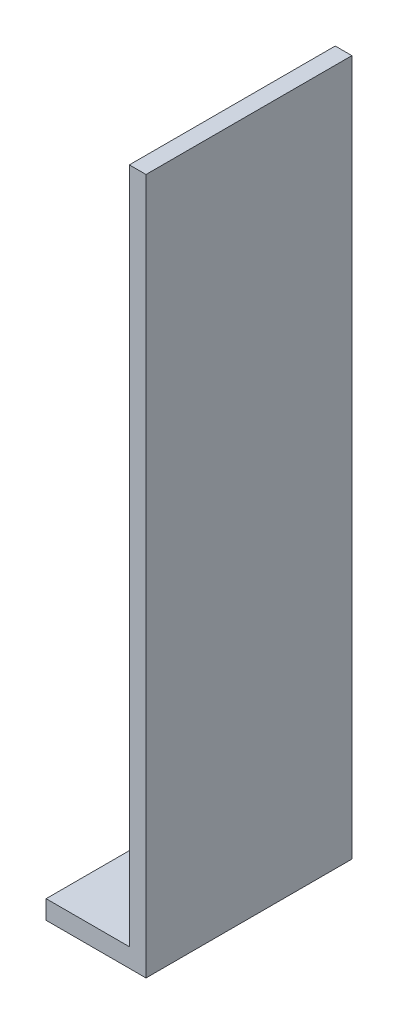
ISO-10303-21;
HEADER;
FILE_DESCRIPTION(('STEP AP214'),'2;1');
FILE_NAME('part.step','',(''),(''),'','','');
FILE_SCHEMA(('AUTOMOTIVE_DESIGN { 1 0 10303 214 1 1 1 1 }'));
ENDSEC;
DATA;
#1=APPLICATION_CONTEXT('core data for automotive mechanical design processes');
#2=APPLICATION_PROTOCOL_DEFINITION('international standard','automotive_design',2000,#1);
#3=PRODUCT_CONTEXT('',#1,'mechanical');
#4=PRODUCT('Part','Part','',(#3));
#5=PRODUCT_RELATED_PRODUCT_CATEGORY('part','',(#4));
#6=PRODUCT_DEFINITION_FORMATION('','',#4);
#7=PRODUCT_DEFINITION_CONTEXT('part definition',#1,'design');
#8=PRODUCT_DEFINITION('design','',#6,#7);
#9=PRODUCT_DEFINITION_SHAPE('','',#8);
#10=(LENGTH_UNIT() NAMED_UNIT(*) SI_UNIT(.MILLI.,.METRE.));
#11=(NAMED_UNIT(*) PLANE_ANGLE_UNIT() SI_UNIT($,.RADIAN.));
#12=(NAMED_UNIT(*) SI_UNIT($,.STERADIAN.) SOLID_ANGLE_UNIT());
#13=UNCERTAINTY_MEASURE_WITH_UNIT(LENGTH_MEASURE(1.E-05),#10,'distance_accuracy_value','');
#14=(GEOMETRIC_REPRESENTATION_CONTEXT(3) GLOBAL_UNCERTAINTY_ASSIGNED_CONTEXT((#13)) GLOBAL_UNIT_ASSIGNED_CONTEXT((#10,
#11,#12)) REPRESENTATION_CONTEXT('',''));
#15=CARTESIAN_POINT('',(0.,0.,0.));
#16=DIRECTION('',(0.,0.,1.));
#17=DIRECTION('',(1.,0.,0.));
#18=AXIS2_PLACEMENT_3D('',#15,#16,#17);
#19=CARTESIAN_POINT('',(0.,-60.6200216651723,68.));
#20=DIRECTION('',(1.,0.,0.));
#21=DIRECTION('',(0.,1.,0.));
#22=AXIS2_PLACEMENT_3D('',#19,#20,#21);
#23=PLANE('',#22);
#24=DIRECTION('',(0.,0.,-1.));
#25=VECTOR('',#24,1.);
#26=CARTESIAN_POINT('',(0.,-60.6200216651723,68.));
#27=LINE('',#26,#25);
#28=CARTESIAN_POINT('',(0.,-60.6200216651723,68.));
#29=VERTEX_POINT('',#28);
#30=CARTESIAN_POINT('',(0.,-60.6200216651723,18.0000000000003));
#31=VERTEX_POINT('',#30);
#32=EDGE_CURVE('E116',#29,#31,#27,.T.);
#33=ORIENTED_EDGE('',*,*,#32,.T.);
#34=DIRECTION('',(0.,1.,0.));
#35=VECTOR('',#34,1.);
#36=CARTESIAN_POINT('',(0.,-65.1756032212671,18.0000000000003));
#37=LINE('',#36,#35);
#38=CARTESIAN_POINT('',(0.,-65.1756032212671,18.0000000000003));
#39=VERTEX_POINT('',#38);
#40=EDGE_CURVE('E50',#39,#31,#37,.T.);
#41=ORIENTED_EDGE('',*,*,#40,.F.);
#42=DIRECTION('',(0.,0.,-1.));
#43=VECTOR('',#42,1.);
#44=CARTESIAN_POINT('',(0.,-65.1756032212671,68.));
#45=LINE('',#44,#43);
#46=CARTESIAN_POINT('',(0.,-65.1756032212671,68.));
#47=VERTEX_POINT('',#46);
#48=EDGE_CURVE('E11',#47,#39,#45,.T.);
#49=ORIENTED_EDGE('',*,*,#48,.F.);
#50=DIRECTION('',(0.,-1.,0.));
#51=VECTOR('',#50,1.);
#52=CARTESIAN_POINT('',(0.,-60.6200216651723,68.));
#53=LINE('',#52,#51);
#54=EDGE_CURVE('E103',#29,#47,#53,.T.);
#55=ORIENTED_EDGE('',*,*,#54,.F.);
#56=EDGE_LOOP('',(#33,#41,#49,#55));
#57=FACE_BOUND('',#56,.T.);
#58=ADVANCED_FACE('F36',(#57),#23,.F.);
#59=CARTESIAN_POINT('',(0.,-65.1756032212671,68.));
#60=DIRECTION('',(0.,1.,0.));
#61=DIRECTION('',(0.,0.,1.));
#62=AXIS2_PLACEMENT_3D('',#59,#60,#61);
#63=PLANE('',#62);
#64=ORIENTED_EDGE('',*,*,#48,.T.);
#65=DIRECTION('',(-1.,0.,0.));
#66=VECTOR('',#65,1.);
#67=CARTESIAN_POINT('',(24.2604104683441,-65.1756032212671,18.0000000000003));
#68=LINE('',#67,#66);
#69=CARTESIAN_POINT('',(24.2604104683441,-65.1756032212671,18.0000000000003));
#70=VERTEX_POINT('',#69);
#71=EDGE_CURVE('E90',#70,#39,#68,.T.);
#72=ORIENTED_EDGE('',*,*,#71,.F.);
#73=DIRECTION('',(0.,0.,-1.));
#74=VECTOR('',#73,1.);
#75=CARTESIAN_POINT('',(24.2604104683441,-65.1756032212671,68.));
#76=LINE('',#75,#74);
#77=CARTESIAN_POINT('',(24.2604104683441,-65.1756032212671,68.));
#78=VERTEX_POINT('',#77);
#79=EDGE_CURVE('E43',#78,#70,#76,.T.);
#80=ORIENTED_EDGE('',*,*,#79,.F.);
#81=DIRECTION('',(1.,0.,0.));
#82=VECTOR('',#81,1.);
#83=CARTESIAN_POINT('',(0.,-65.1756032212671,68.));
#84=LINE('',#83,#82);
#85=EDGE_CURVE('E125',#47,#78,#84,.T.);
#86=ORIENTED_EDGE('',*,*,#85,.F.);
#87=EDGE_LOOP('',(#64,#72,#80,#86));
#88=FACE_BOUND('',#87,.T.);
#89=ADVANCED_FACE('F100',(#88),#63,.F.);
#90=CARTESIAN_POINT('',(24.2604104683441,-65.1756032212671,68.));
#91=DIRECTION('',(-1.,0.,0.));
#92=DIRECTION('',(0.,0.,1.));
#93=AXIS2_PLACEMENT_3D('',#90,#91,#92);
#94=PLANE('',#93);
#95=ORIENTED_EDGE('',*,*,#79,.T.);
#96=DIRECTION('',(0.,-1.,0.));
#97=VECTOR('',#96,1.);
#98=CARTESIAN_POINT('',(24.2604104683441,103.824396778733,18.0000000000003));
#99=LINE('',#98,#97);
#100=CARTESIAN_POINT('',(24.2604104683441,103.824396778733,18.0000000000003));
#101=VERTEX_POINT('',#100);
#102=EDGE_CURVE('E87',#101,#70,#99,.T.);
#103=ORIENTED_EDGE('',*,*,#102,.F.);
#104=DIRECTION('',(0.,0.,-1.));
#105=VECTOR('',#104,1.);
#106=CARTESIAN_POINT('',(24.2604104683441,103.824396778733,68.));
#107=LINE('',#106,#105);
#108=CARTESIAN_POINT('',(24.2604104683441,103.824396778733,68.));
#109=VERTEX_POINT('',#108);
#110=EDGE_CURVE('E107',#109,#101,#107,.T.);
#111=ORIENTED_EDGE('',*,*,#110,.F.);
#112=DIRECTION('',(0.,1.,0.));
#113=VECTOR('',#112,1.);
#114=CARTESIAN_POINT('',(24.2604104683441,-65.1756032212671,68.));
#115=LINE('',#114,#113);
#116=EDGE_CURVE('E106',#78,#109,#115,.T.);
#117=ORIENTED_EDGE('',*,*,#116,.F.);
#118=EDGE_LOOP('',(#95,#103,#111,#117));
#119=FACE_BOUND('',#118,.T.);
#120=ADVANCED_FACE('F105',(#119),#94,.F.);
#121=CARTESIAN_POINT('',(24.2604104683441,103.824396778733,68.));
#122=DIRECTION('',(0.,-1.,0.));
#123=DIRECTION('',(0.,0.,-1.));
#124=AXIS2_PLACEMENT_3D('',#121,#122,#123);
#125=PLANE('',#124);
#126=ORIENTED_EDGE('',*,*,#110,.T.);
#127=DIRECTION('',(1.,0.,0.));
#128=VECTOR('',#127,1.);
#129=CARTESIAN_POINT('',(20.2141706881323,103.824396778733,18.0000000000003));
#130=LINE('',#129,#128);
#131=CARTESIAN_POINT('',(20.2141706881323,103.824396778733,18.0000000000003));
#132=VERTEX_POINT('',#131);
#133=EDGE_CURVE('E92',#132,#101,#130,.T.);
#134=ORIENTED_EDGE('',*,*,#133,.F.);
#135=DIRECTION('',(0.,0.,-1.));
#136=VECTOR('',#135,1.);
#137=CARTESIAN_POINT('',(20.2141706881323,103.824396778733,68.));
#138=LINE('',#137,#136);
#139=CARTESIAN_POINT('',(20.2141706881323,103.824396778733,68.));
#140=VERTEX_POINT('',#139);
#141=EDGE_CURVE('E108',#140,#132,#138,.T.);
#142=ORIENTED_EDGE('',*,*,#141,.F.);
#143=DIRECTION('',(-1.,0.,0.));
#144=VECTOR('',#143,1.);
#145=CARTESIAN_POINT('',(24.2604104683441,103.824396778733,68.));
#146=LINE('',#145,#144);
#147=EDGE_CURVE('E122',#109,#140,#146,.T.);
#148=ORIENTED_EDGE('',*,*,#147,.F.);
#149=EDGE_LOOP('',(#126,#134,#142,#148));
#150=FACE_BOUND('',#149,.T.);
#151=ADVANCED_FACE('F138',(#150),#125,.F.);
#152=CARTESIAN_POINT('',(20.2141706881323,103.824396778733,68.));
#153=DIRECTION('',(1.,0.,0.));
#154=DIRECTION('',(0.,1.,0.));
#155=AXIS2_PLACEMENT_3D('',#152,#153,#154);
#156=PLANE('',#155);
#157=ORIENTED_EDGE('',*,*,#141,.T.);
#158=DIRECTION('',(0.,1.,0.));
#159=VECTOR('',#158,1.);
#160=CARTESIAN_POINT('',(20.2141706881323,-60.6200216651723,18.0000000000003));
#161=LINE('',#160,#159);
#162=CARTESIAN_POINT('',(20.2141706881323,-60.6200216651723,18.0000000000003));
#163=VERTEX_POINT('',#162);
#164=EDGE_CURVE('E130',#163,#132,#161,.T.);
#165=ORIENTED_EDGE('',*,*,#164,.F.);
#166=DIRECTION('',(0.,0.,-1.));
#167=VECTOR('',#166,1.);
#168=CARTESIAN_POINT('',(20.2141706881323,-60.6200216651723,68.));
#169=LINE('',#168,#167);
#170=CARTESIAN_POINT('',(20.2141706881323,-60.6200216651723,68.));
#171=VERTEX_POINT('',#170);
#172=EDGE_CURVE('E113',#171,#163,#169,.T.);
#173=ORIENTED_EDGE('',*,*,#172,.F.);
#174=DIRECTION('',(0.,-1.,0.));
#175=VECTOR('',#174,1.);
#176=CARTESIAN_POINT('',(20.2141706881323,103.824396778733,68.));
#177=LINE('',#176,#175);
#178=EDGE_CURVE('E120',#140,#171,#177,.T.);
#179=ORIENTED_EDGE('',*,*,#178,.F.);
#180=EDGE_LOOP('',(#157,#165,#173,#179));
#181=FACE_BOUND('',#180,.T.);
#182=ADVANCED_FACE('F141',(#181),#156,.F.);
#183=CARTESIAN_POINT('',(20.2141706881323,-60.6200216651723,68.));
#184=DIRECTION('',(0.,-1.,0.));
#185=DIRECTION('',(1.,0.,0.));
#186=AXIS2_PLACEMENT_3D('',#183,#184,#185);
#187=PLANE('',#186);
#188=ORIENTED_EDGE('',*,*,#172,.T.);
#189=DIRECTION('',(1.,0.,0.));
#190=VECTOR('',#189,1.);
#191=CARTESIAN_POINT('',(0.,-60.6200216651723,18.0000000000003));
#192=LINE('',#191,#190);
#193=EDGE_CURVE('E128',#31,#163,#192,.T.);
#194=ORIENTED_EDGE('',*,*,#193,.F.);
#195=ORIENTED_EDGE('',*,*,#32,.F.);
#196=DIRECTION('',(-1.,0.,0.));
#197=VECTOR('',#196,1.);
#198=CARTESIAN_POINT('',(20.2141706881323,-60.6200216651723,68.));
#199=LINE('',#198,#197);
#200=EDGE_CURVE('E58',#171,#29,#199,.T.);
#201=ORIENTED_EDGE('',*,*,#200,.F.);
#202=EDGE_LOOP('',(#188,#194,#195,#201));
#203=FACE_BOUND('',#202,.T.);
#204=ADVANCED_FACE('F146',(#203),#187,.F.);
#205=CARTESIAN_POINT('',(0.,0.,68.));
#206=DIRECTION('',(0.,0.,1.));
#207=DIRECTION('',(1.,0.,0.));
#208=AXIS2_PLACEMENT_3D('',#205,#206,#207);
#209=PLANE('',#208);
#210=ORIENTED_EDGE('',*,*,#54,.T.);
#211=ORIENTED_EDGE('',*,*,#85,.T.);
#212=ORIENTED_EDGE('',*,*,#116,.T.);
#213=ORIENTED_EDGE('',*,*,#147,.T.);
#214=ORIENTED_EDGE('',*,*,#178,.T.);
#215=ORIENTED_EDGE('',*,*,#200,.T.);
#216=EDGE_LOOP('',(#210,#211,#212,#213,#214,#215));
#217=FACE_BOUND('',#216,.T.);
#218=ADVANCED_FACE('F142',(#217),#209,.T.);
#219=CARTESIAN_POINT('',(63.2604104683441,108.524396778729,18.0000000000003));
#220=DIRECTION('',(0.,0.,1.));
#221=DIRECTION('',(-1.,0.,0.));
#222=AXIS2_PLACEMENT_3D('',#219,#220,#221);
#223=PLANE('',#222);
#224=ORIENTED_EDGE('',*,*,#71,.T.);
#225=ORIENTED_EDGE('',*,*,#40,.T.);
#226=ORIENTED_EDGE('',*,*,#193,.T.);
#227=ORIENTED_EDGE('',*,*,#164,.T.);
#228=ORIENTED_EDGE('',*,*,#133,.T.);
#229=ORIENTED_EDGE('',*,*,#102,.T.);
#230=EDGE_LOOP('',(#224,#225,#226,#227,#228,#229));
#231=FACE_BOUND('',#230,.T.);
#232=ADVANCED_FACE('F89',(#231),#223,.F.);
#233=CLOSED_SHELL('',(#58,#89,#120,#151,#182,#204,#218,#232));
#234=MANIFOLD_SOLID_BREP('B2',#233);
#235=ADVANCED_BREP_SHAPE_REPRESENTATION('',(#18,#234),#14);
#236=SHAPE_DEFINITION_REPRESENTATION(#9,#235);
ENDSEC;
END-ISO-10303-21;
